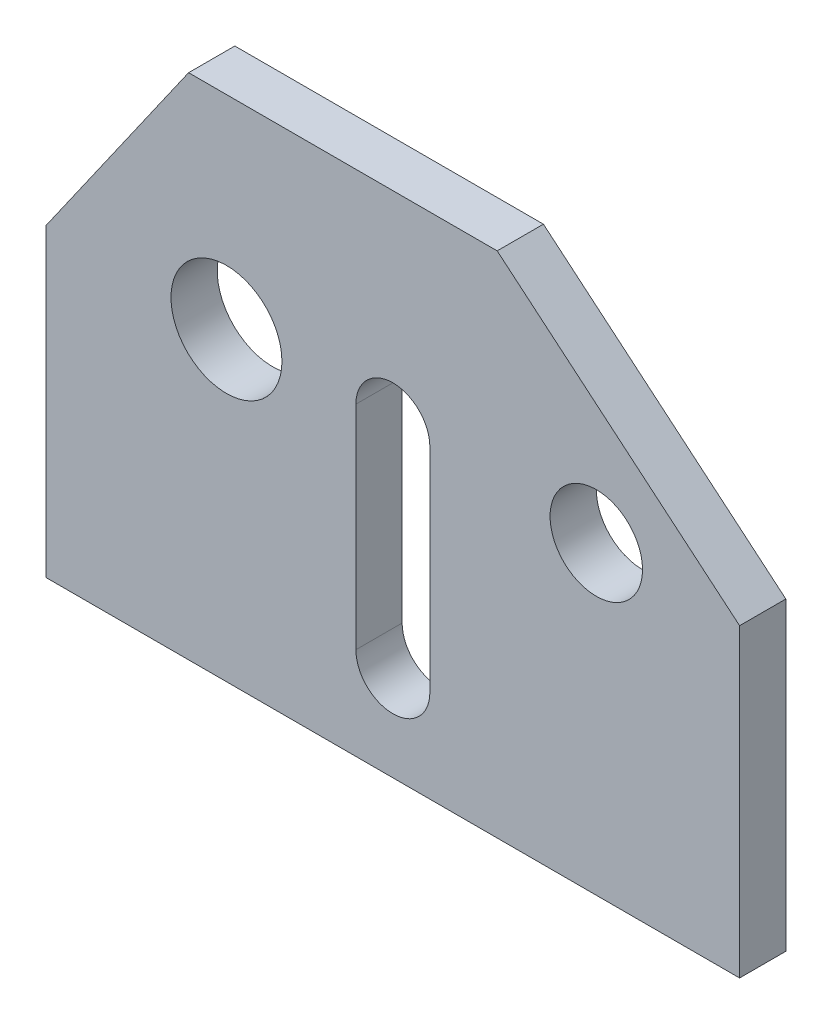
ISO-10303-21;
HEADER;
FILE_DESCRIPTION(('STEP AP214'),'2;1');
FILE_NAME('part.step','',(''),(''),'','','');
FILE_SCHEMA(('AUTOMOTIVE_DESIGN { 1 0 10303 214 1 1 1 1 }'));
ENDSEC;
DATA;
#1=APPLICATION_CONTEXT('core data for automotive mechanical design processes');
#2=APPLICATION_PROTOCOL_DEFINITION('international standard','automotive_design',2000,#1);
#3=PRODUCT_CONTEXT('',#1,'mechanical');
#4=PRODUCT('Part','Part','',(#3));
#5=PRODUCT_RELATED_PRODUCT_CATEGORY('part','',(#4));
#6=PRODUCT_DEFINITION_FORMATION('','',#4);
#7=PRODUCT_DEFINITION_CONTEXT('part definition',#1,'design');
#8=PRODUCT_DEFINITION('design','',#6,#7);
#9=PRODUCT_DEFINITION_SHAPE('','',#8);
#10=(LENGTH_UNIT() NAMED_UNIT(*) SI_UNIT(.MILLI.,.METRE.));
#11=(NAMED_UNIT(*) PLANE_ANGLE_UNIT() SI_UNIT($,.RADIAN.));
#12=(NAMED_UNIT(*) SI_UNIT($,.STERADIAN.) SOLID_ANGLE_UNIT());
#13=UNCERTAINTY_MEASURE_WITH_UNIT(LENGTH_MEASURE(1.E-05),#10,'distance_accuracy_value','');
#14=(GEOMETRIC_REPRESENTATION_CONTEXT(3) GLOBAL_UNCERTAINTY_ASSIGNED_CONTEXT((#13)) GLOBAL_UNIT_ASSIGNED_CONTEXT((#10,
#11,#12)) REPRESENTATION_CONTEXT('',''));
#15=CARTESIAN_POINT('',(0.,0.,0.));
#16=DIRECTION('',(0.,0.,1.));
#17=DIRECTION('',(1.,0.,0.));
#18=AXIS2_PLACEMENT_3D('',#15,#16,#17);
#19=CARTESIAN_POINT('',(0.,0.,5.));
#20=DIRECTION('',(0.,0.,1.));
#21=DIRECTION('',(1.,0.,0.));
#22=AXIS2_PLACEMENT_3D('',#19,#20,#21);
#23=PLANE('',#22);
#24=CARTESIAN_POINT('',(19.5,33.,5.));
#25=DIRECTION('',(0.,0.,1.));
#26=DIRECTION('',(1.,0.,0.));
#27=AXIS2_PLACEMENT_3D('',#24,#25,#26);
#28=CIRCLE('',#27,6.);
#29=CARTESIAN_POINT('',(25.5,33.,5.));
#30=VERTEX_POINT('',#29);
#31=EDGE_CURVE('E156',#30,#30,#28,.T.);
#32=ORIENTED_EDGE('',*,*,#31,.F.);
#33=EDGE_LOOP('',(#32));
#34=FACE_BOUND('',#33,.T.);
#35=DIRECTION('',(0.,-1.,0.));
#36=VECTOR('',#35,1.);
#37=CARTESIAN_POINT('',(0.,33.,5.));
#38=LINE('',#37,#36);
#39=CARTESIAN_POINT('',(0.,33.,5.));
#40=VERTEX_POINT('',#39);
#41=CARTESIAN_POINT('',(0.,0.,5.));
#42=VERTEX_POINT('',#41);
#43=EDGE_CURVE('E163',#40,#42,#38,.T.);
#44=ORIENTED_EDGE('',*,*,#43,.T.);
#45=DIRECTION('',(1.,0.,0.));
#46=VECTOR('',#45,1.);
#47=CARTESIAN_POINT('',(0.,0.,5.));
#48=LINE('',#47,#46);
#49=CARTESIAN_POINT('',(75.,0.,5.));
#50=VERTEX_POINT('',#49);
#51=EDGE_CURVE('E167',#42,#50,#48,.T.);
#52=ORIENTED_EDGE('',*,*,#51,.T.);
#53=DIRECTION('',(0.,1.,0.));
#54=VECTOR('',#53,1.);
#55=CARTESIAN_POINT('',(75.,0.,5.));
#56=LINE('',#55,#54);
#57=CARTESIAN_POINT('',(75.,33.,5.));
#58=VERTEX_POINT('',#57);
#59=EDGE_CURVE('E169',#50,#58,#56,.T.);
#60=ORIENTED_EDGE('',*,*,#59,.T.);
#61=DIRECTION('',(-0.766044443118979,0.642787609686538,0.));
#62=VECTOR('',#61,1.);
#63=CARTESIAN_POINT('',(75.,33.,5.));
#64=LINE('',#63,#62);
#65=CARTESIAN_POINT('',(48.7814209629273,55.,5.));
#66=VERTEX_POINT('',#65);
#67=EDGE_CURVE('E175',#58,#66,#64,.T.);
#68=ORIENTED_EDGE('',*,*,#67,.T.);
#69=DIRECTION('',(-1.,0.,0.));
#70=VECTOR('',#69,1.);
#71=CARTESIAN_POINT('',(48.7814209629273,55.,5.));
#72=LINE('',#71,#70);
#73=CARTESIAN_POINT('',(15.4045658406137,55.,5.));
#74=VERTEX_POINT('',#73);
#75=EDGE_CURVE('E174',#66,#74,#72,.T.);
#76=ORIENTED_EDGE('',*,*,#75,.T.);
#77=DIRECTION('',(-0.573576436351047,-0.819152044288991,0.));
#78=VECTOR('',#77,1.);
#79=CARTESIAN_POINT('',(15.4045658406137,55.,5.));
#80=LINE('',#79,#78);
#81=EDGE_CURVE('E176',#74,#40,#80,.T.);
#82=ORIENTED_EDGE('',*,*,#81,.T.);
#83=EDGE_LOOP('',(#44,#52,#60,#68,#76,#82));
#84=FACE_BOUND('',#83,.T.);
#85=CARTESIAN_POINT('',(59.5,33.,5.));
#86=DIRECTION('',(0.,0.,1.));
#87=DIRECTION('',(1.,0.,0.));
#88=AXIS2_PLACEMENT_3D('',#85,#86,#87);
#89=CIRCLE('',#88,5.00000000000001);
#90=CARTESIAN_POINT('',(64.5,33.,5.));
#91=VERTEX_POINT('',#90);
#92=EDGE_CURVE('E152',#91,#91,#89,.T.);
#93=ORIENTED_EDGE('',*,*,#92,.F.);
#94=EDGE_LOOP('',(#93));
#95=FACE_BOUND('',#94,.T.);
#96=DIRECTION('',(0.,-1.,0.));
#97=VECTOR('',#96,1.);
#98=CARTESIAN_POINT('',(33.5,33.,5.));
#99=LINE('',#98,#97);
#100=CARTESIAN_POINT('',(33.5,33.,5.));
#101=VERTEX_POINT('',#100);
#102=CARTESIAN_POINT('',(33.5,10.,5.));
#103=VERTEX_POINT('',#102);
#104=EDGE_CURVE('E125',#101,#103,#99,.T.);
#105=ORIENTED_EDGE('',*,*,#104,.F.);
#106=CARTESIAN_POINT('',(37.5,33.,5.));
#107=DIRECTION('',(0.,0.,1.));
#108=DIRECTION('',(1.,0.,0.));
#109=AXIS2_PLACEMENT_3D('',#106,#107,#108);
#110=CIRCLE('',#109,4.);
#111=CARTESIAN_POINT('',(41.5,33.,5.));
#112=VERTEX_POINT('',#111);
#113=EDGE_CURVE('E116',#112,#101,#110,.T.);
#114=ORIENTED_EDGE('',*,*,#113,.F.);
#115=DIRECTION('',(0.,1.,0.));
#116=VECTOR('',#115,1.);
#117=CARTESIAN_POINT('',(41.5,33.,5.));
#118=LINE('',#117,#116);
#119=CARTESIAN_POINT('',(41.5,10.,5.));
#120=VERTEX_POINT('',#119);
#121=EDGE_CURVE('E138',#120,#112,#118,.T.);
#122=ORIENTED_EDGE('',*,*,#121,.F.);
#123=CARTESIAN_POINT('',(37.5,10.,5.));
#124=DIRECTION('',(0.,0.,1.));
#125=DIRECTION('',(1.,0.,0.));
#126=AXIS2_PLACEMENT_3D('',#123,#124,#125);
#127=CIRCLE('',#126,3.99999999999999);
#128=EDGE_CURVE('E136',#103,#120,#127,.T.);
#129=ORIENTED_EDGE('',*,*,#128,.F.);
#130=EDGE_LOOP('',(#105,#114,#122,#129));
#131=FACE_BOUND('',#130,.T.);
#132=ADVANCED_FACE('F39',(#34,#84,#95,#131),#23,.T.);
#133=CARTESIAN_POINT('',(0.,0.,0.));
#134=DIRECTION('',(0.,0.,1.));
#135=DIRECTION('',(1.,0.,0.));
#136=AXIS2_PLACEMENT_3D('',#133,#134,#135);
#137=PLANE('',#136);
#138=CARTESIAN_POINT('',(59.5,33.,0.));
#139=DIRECTION('',(0.,0.,1.));
#140=DIRECTION('',(1.,0.,0.));
#141=AXIS2_PLACEMENT_3D('',#138,#139,#140);
#142=CIRCLE('',#141,5.00000000000001);
#143=CARTESIAN_POINT('',(64.5,33.,0.));
#144=VERTEX_POINT('',#143);
#145=EDGE_CURVE('E135',#144,#144,#142,.T.);
#146=ORIENTED_EDGE('',*,*,#145,.T.);
#147=EDGE_LOOP('',(#146));
#148=FACE_BOUND('',#147,.T.);
#149=CARTESIAN_POINT('',(19.5,33.,0.));
#150=DIRECTION('',(0.,0.,1.));
#151=DIRECTION('',(1.,0.,0.));
#152=AXIS2_PLACEMENT_3D('',#149,#150,#151);
#153=CIRCLE('',#152,6.);
#154=CARTESIAN_POINT('',(25.5,33.,0.));
#155=VERTEX_POINT('',#154);
#156=EDGE_CURVE('E155',#155,#155,#153,.T.);
#157=ORIENTED_EDGE('',*,*,#156,.T.);
#158=EDGE_LOOP('',(#157));
#159=FACE_BOUND('',#158,.T.);
#160=DIRECTION('',(0.,-1.,0.));
#161=VECTOR('',#160,1.);
#162=CARTESIAN_POINT('',(0.,33.,0.));
#163=LINE('',#162,#161);
#164=CARTESIAN_POINT('',(0.,33.,0.));
#165=VERTEX_POINT('',#164);
#166=CARTESIAN_POINT('',(0.,0.,0.));
#167=VERTEX_POINT('',#166);
#168=EDGE_CURVE('E161',#165,#167,#163,.T.);
#169=ORIENTED_EDGE('',*,*,#168,.F.);
#170=DIRECTION('',(-0.573576436351047,-0.819152044288991,0.));
#171=VECTOR('',#170,1.);
#172=CARTESIAN_POINT('',(15.4045658406137,55.,0.));
#173=LINE('',#172,#171);
#174=CARTESIAN_POINT('',(15.4045658406137,55.,0.));
#175=VERTEX_POINT('',#174);
#176=EDGE_CURVE('E166',#175,#165,#173,.T.);
#177=ORIENTED_EDGE('',*,*,#176,.F.);
#178=DIRECTION('',(-1.,0.,0.));
#179=VECTOR('',#178,1.);
#180=CARTESIAN_POINT('',(48.7814209629273,55.,0.));
#181=LINE('',#180,#179);
#182=CARTESIAN_POINT('',(48.7814209629273,55.,0.));
#183=VERTEX_POINT('',#182);
#184=EDGE_CURVE('E190',#183,#175,#181,.T.);
#185=ORIENTED_EDGE('',*,*,#184,.F.);
#186=DIRECTION('',(-0.766044443118979,0.642787609686538,0.));
#187=VECTOR('',#186,1.);
#188=CARTESIAN_POINT('',(75.,33.,0.));
#189=LINE('',#188,#187);
#190=CARTESIAN_POINT('',(75.,33.,0.));
#191=VERTEX_POINT('',#190);
#192=EDGE_CURVE('E184',#191,#183,#189,.T.);
#193=ORIENTED_EDGE('',*,*,#192,.F.);
#194=DIRECTION('',(0.,1.,0.));
#195=VECTOR('',#194,1.);
#196=CARTESIAN_POINT('',(75.,0.,0.));
#197=LINE('',#196,#195);
#198=CARTESIAN_POINT('',(75.,0.,0.));
#199=VERTEX_POINT('',#198);
#200=EDGE_CURVE('E183',#199,#191,#197,.T.);
#201=ORIENTED_EDGE('',*,*,#200,.F.);
#202=DIRECTION('',(1.,0.,0.));
#203=VECTOR('',#202,1.);
#204=CARTESIAN_POINT('',(0.,0.,0.));
#205=LINE('',#204,#203);
#206=EDGE_CURVE('E181',#167,#199,#205,.T.);
#207=ORIENTED_EDGE('',*,*,#206,.F.);
#208=EDGE_LOOP('',(#169,#177,#185,#193,#201,#207));
#209=FACE_BOUND('',#208,.T.);
#210=CARTESIAN_POINT('',(37.5,33.,0.));
#211=DIRECTION('',(0.,0.,1.));
#212=DIRECTION('',(1.,0.,0.));
#213=AXIS2_PLACEMENT_3D('',#210,#211,#212);
#214=CIRCLE('',#213,4.);
#215=CARTESIAN_POINT('',(41.5,33.,0.));
#216=VERTEX_POINT('',#215);
#217=CARTESIAN_POINT('',(33.5,33.,0.));
#218=VERTEX_POINT('',#217);
#219=EDGE_CURVE('E62',#216,#218,#214,.T.);
#220=ORIENTED_EDGE('',*,*,#219,.T.);
#221=DIRECTION('',(0.,-1.,0.));
#222=VECTOR('',#221,1.);
#223=CARTESIAN_POINT('',(33.5,33.,0.));
#224=LINE('',#223,#222);
#225=CARTESIAN_POINT('',(33.5,10.,0.));
#226=VERTEX_POINT('',#225);
#227=EDGE_CURVE('E131',#218,#226,#224,.T.);
#228=ORIENTED_EDGE('',*,*,#227,.T.);
#229=CARTESIAN_POINT('',(37.5,10.,0.));
#230=DIRECTION('',(0.,0.,1.));
#231=DIRECTION('',(1.,0.,0.));
#232=AXIS2_PLACEMENT_3D('',#229,#230,#231);
#233=CIRCLE('',#232,3.99999999999999);
#234=CARTESIAN_POINT('',(41.5,10.,0.));
#235=VERTEX_POINT('',#234);
#236=EDGE_CURVE('E143',#226,#235,#233,.T.);
#237=ORIENTED_EDGE('',*,*,#236,.T.);
#238=DIRECTION('',(0.,1.,0.));
#239=VECTOR('',#238,1.);
#240=CARTESIAN_POINT('',(41.5,33.,0.));
#241=LINE('',#240,#239);
#242=EDGE_CURVE('E124',#235,#216,#241,.T.);
#243=ORIENTED_EDGE('',*,*,#242,.T.);
#244=EDGE_LOOP('',(#220,#228,#237,#243));
#245=FACE_BOUND('',#244,.T.);
#246=ADVANCED_FACE('F213',(#148,#159,#209,#245),#137,.F.);
#247=CARTESIAN_POINT('',(0.,33.,5.));
#248=DIRECTION('',(1.,0.,0.));
#249=DIRECTION('',(0.,1.,0.));
#250=AXIS2_PLACEMENT_3D('',#247,#248,#249);
#251=PLANE('',#250);
#252=ORIENTED_EDGE('',*,*,#168,.T.);
#253=DIRECTION('',(0.,0.,-1.));
#254=VECTOR('',#253,1.);
#255=CARTESIAN_POINT('',(0.,0.,5.));
#256=LINE('',#255,#254);
#257=EDGE_CURVE('E11',#42,#167,#256,.T.);
#258=ORIENTED_EDGE('',*,*,#257,.F.);
#259=ORIENTED_EDGE('',*,*,#43,.F.);
#260=DIRECTION('',(0.,0.,-1.));
#261=VECTOR('',#260,1.);
#262=CARTESIAN_POINT('',(0.,33.,5.));
#263=LINE('',#262,#261);
#264=EDGE_CURVE('E178',#40,#165,#263,.T.);
#265=ORIENTED_EDGE('',*,*,#264,.T.);
#266=EDGE_LOOP('',(#252,#258,#259,#265));
#267=FACE_BOUND('',#266,.T.);
#268=ADVANCED_FACE('F41',(#267),#251,.F.);
#269=CARTESIAN_POINT('',(0.,0.,5.));
#270=DIRECTION('',(0.,1.,0.));
#271=DIRECTION('',(0.,0.,1.));
#272=AXIS2_PLACEMENT_3D('',#269,#270,#271);
#273=PLANE('',#272);
#274=ORIENTED_EDGE('',*,*,#206,.T.);
#275=DIRECTION('',(0.,0.,-1.));
#276=VECTOR('',#275,1.);
#277=CARTESIAN_POINT('',(75.,0.,5.));
#278=LINE('',#277,#276);
#279=EDGE_CURVE('E50',#50,#199,#278,.T.);
#280=ORIENTED_EDGE('',*,*,#279,.F.);
#281=ORIENTED_EDGE('',*,*,#51,.F.);
#282=ORIENTED_EDGE('',*,*,#257,.T.);
#283=EDGE_LOOP('',(#274,#280,#281,#282));
#284=FACE_BOUND('',#283,.T.);
#285=ADVANCED_FACE('F227',(#284),#273,.F.);
#286=CARTESIAN_POINT('',(75.,0.,5.));
#287=DIRECTION('',(-1.,0.,0.));
#288=DIRECTION('',(0.,0.,1.));
#289=AXIS2_PLACEMENT_3D('',#286,#287,#288);
#290=PLANE('',#289);
#291=ORIENTED_EDGE('',*,*,#200,.T.);
#292=DIRECTION('',(0.,0.,-1.));
#293=VECTOR('',#292,1.);
#294=CARTESIAN_POINT('',(75.,33.,5.));
#295=LINE('',#294,#293);
#296=EDGE_CURVE('E199',#58,#191,#295,.T.);
#297=ORIENTED_EDGE('',*,*,#296,.F.);
#298=ORIENTED_EDGE('',*,*,#59,.F.);
#299=ORIENTED_EDGE('',*,*,#279,.T.);
#300=EDGE_LOOP('',(#291,#297,#298,#299));
#301=FACE_BOUND('',#300,.T.);
#302=ADVANCED_FACE('F203',(#301),#290,.F.);
#303=CARTESIAN_POINT('',(75.,33.,5.));
#304=DIRECTION('',(-0.642787609686538,-0.766044443118979,0.));
#305=DIRECTION('',(0.766044443118979,-0.642787609686538,0.));
#306=AXIS2_PLACEMENT_3D('',#303,#304,#305);
#307=PLANE('',#306);
#308=ORIENTED_EDGE('',*,*,#192,.T.);
#309=DIRECTION('',(0.,0.,-1.));
#310=VECTOR('',#309,1.);
#311=CARTESIAN_POINT('',(48.7814209629273,55.,5.));
#312=LINE('',#311,#310);
#313=EDGE_CURVE('E193',#66,#183,#312,.T.);
#314=ORIENTED_EDGE('',*,*,#313,.F.);
#315=ORIENTED_EDGE('',*,*,#67,.F.);
#316=ORIENTED_EDGE('',*,*,#296,.T.);
#317=EDGE_LOOP('',(#308,#314,#315,#316));
#318=FACE_BOUND('',#317,.T.);
#319=ADVANCED_FACE('F220',(#318),#307,.F.);
#320=CARTESIAN_POINT('',(48.7814209629273,55.,5.));
#321=DIRECTION('',(0.,-1.,0.));
#322=DIRECTION('',(1.,0.,0.));
#323=AXIS2_PLACEMENT_3D('',#320,#321,#322);
#324=PLANE('',#323);
#325=ORIENTED_EDGE('',*,*,#184,.T.);
#326=DIRECTION('',(0.,0.,-1.));
#327=VECTOR('',#326,1.);
#328=CARTESIAN_POINT('',(15.4045658406137,55.,5.));
#329=LINE('',#328,#327);
#330=EDGE_CURVE('E195',#74,#175,#329,.T.);
#331=ORIENTED_EDGE('',*,*,#330,.F.);
#332=ORIENTED_EDGE('',*,*,#75,.F.);
#333=ORIENTED_EDGE('',*,*,#313,.T.);
#334=EDGE_LOOP('',(#325,#331,#332,#333));
#335=FACE_BOUND('',#334,.T.);
#336=ADVANCED_FACE('F221',(#335),#324,.F.);
#337=CARTESIAN_POINT('',(15.4045658406137,55.,5.));
#338=DIRECTION('',(0.819152044288991,-0.573576436351047,0.));
#339=DIRECTION('',(0.573576436351047,0.819152044288991,0.));
#340=AXIS2_PLACEMENT_3D('',#337,#338,#339);
#341=PLANE('',#340);
#342=ORIENTED_EDGE('',*,*,#176,.T.);
#343=ORIENTED_EDGE('',*,*,#264,.F.);
#344=ORIENTED_EDGE('',*,*,#81,.F.);
#345=ORIENTED_EDGE('',*,*,#330,.T.);
#346=EDGE_LOOP('',(#342,#343,#344,#345));
#347=FACE_BOUND('',#346,.T.);
#348=ADVANCED_FACE('F235',(#347),#341,.F.);
#349=CARTESIAN_POINT('',(19.5,33.,5.));
#350=DIRECTION('',(0.,0.,-1.));
#351=DIRECTION('',(-1.,0.,0.));
#352=AXIS2_PLACEMENT_3D('',#349,#350,#351);
#353=CYLINDRICAL_SURFACE('',#352,6.);
#354=ORIENTED_EDGE('',*,*,#31,.T.);
#355=EDGE_LOOP('',(#354));
#356=FACE_BOUND('',#355,.T.);
#357=ORIENTED_EDGE('',*,*,#156,.F.);
#358=EDGE_LOOP('',(#357));
#359=FACE_BOUND('',#358,.T.);
#360=ADVANCED_FACE('F233',(#356,#359),#353,.F.);
#361=CARTESIAN_POINT('',(59.5,33.,5.));
#362=DIRECTION('',(0.,0.,-1.));
#363=DIRECTION('',(-1.,0.,0.));
#364=AXIS2_PLACEMENT_3D('',#361,#362,#363);
#365=CYLINDRICAL_SURFACE('',#364,5.00000000000001);
#366=ORIENTED_EDGE('',*,*,#92,.T.);
#367=EDGE_LOOP('',(#366));
#368=FACE_BOUND('',#367,.T.);
#369=ORIENTED_EDGE('',*,*,#145,.F.);
#370=EDGE_LOOP('',(#369));
#371=FACE_BOUND('',#370,.T.);
#372=ADVANCED_FACE('F238',(#368,#371),#365,.F.);
#373=CARTESIAN_POINT('',(37.5,33.,5.));
#374=DIRECTION('',(0.,0.,-1.));
#375=DIRECTION('',(-1.,0.,0.));
#376=AXIS2_PLACEMENT_3D('',#373,#374,#375);
#377=CYLINDRICAL_SURFACE('',#376,4.);
#378=ORIENTED_EDGE('',*,*,#219,.F.);
#379=DIRECTION('',(0.,0.,-1.));
#380=VECTOR('',#379,1.);
#381=CARTESIAN_POINT('',(41.5,33.,5.));
#382=LINE('',#381,#380);
#383=EDGE_CURVE('E120',#112,#216,#382,.T.);
#384=ORIENTED_EDGE('',*,*,#383,.F.);
#385=ORIENTED_EDGE('',*,*,#113,.T.);
#386=DIRECTION('',(0.,0.,-1.));
#387=VECTOR('',#386,1.);
#388=CARTESIAN_POINT('',(33.5,33.,5.));
#389=LINE('',#388,#387);
#390=EDGE_CURVE('E118',#101,#218,#389,.T.);
#391=ORIENTED_EDGE('',*,*,#390,.T.);
#392=EDGE_LOOP('',(#378,#384,#385,#391));
#393=FACE_BOUND('',#392,.T.);
#394=ADVANCED_FACE('F119',(#393),#377,.F.);
#395=CARTESIAN_POINT('',(33.5,33.,5.));
#396=DIRECTION('',(1.,0.,0.));
#397=DIRECTION('',(0.,1.,0.));
#398=AXIS2_PLACEMENT_3D('',#395,#396,#397);
#399=PLANE('',#398);
#400=ORIENTED_EDGE('',*,*,#227,.F.);
#401=ORIENTED_EDGE('',*,*,#390,.F.);
#402=ORIENTED_EDGE('',*,*,#104,.T.);
#403=DIRECTION('',(0.,0.,-1.));
#404=VECTOR('',#403,1.);
#405=CARTESIAN_POINT('',(33.5,10.,5.));
#406=LINE('',#405,#404);
#407=EDGE_CURVE('E133',#103,#226,#406,.T.);
#408=ORIENTED_EDGE('',*,*,#407,.T.);
#409=EDGE_LOOP('',(#400,#401,#402,#408));
#410=FACE_BOUND('',#409,.T.);
#411=ADVANCED_FACE('F126',(#410),#399,.T.);
#412=CARTESIAN_POINT('',(37.5,10.,5.));
#413=DIRECTION('',(0.,0.,-1.));
#414=DIRECTION('',(-1.,0.,0.));
#415=AXIS2_PLACEMENT_3D('',#412,#413,#414);
#416=CYLINDRICAL_SURFACE('',#415,3.99999999999999);
#417=ORIENTED_EDGE('',*,*,#236,.F.);
#418=ORIENTED_EDGE('',*,*,#407,.F.);
#419=ORIENTED_EDGE('',*,*,#128,.T.);
#420=DIRECTION('',(0.,0.,-1.));
#421=VECTOR('',#420,1.);
#422=CARTESIAN_POINT('',(41.5,10.,5.));
#423=LINE('',#422,#421);
#424=EDGE_CURVE('E53',#120,#235,#423,.T.);
#425=ORIENTED_EDGE('',*,*,#424,.T.);
#426=EDGE_LOOP('',(#417,#418,#419,#425));
#427=FACE_BOUND('',#426,.T.);
#428=ADVANCED_FACE('F263',(#427),#416,.F.);
#429=CARTESIAN_POINT('',(41.5,33.,5.));
#430=DIRECTION('',(-1.,0.,0.));
#431=DIRECTION('',(0.,0.,1.));
#432=AXIS2_PLACEMENT_3D('',#429,#430,#431);
#433=PLANE('',#432);
#434=ORIENTED_EDGE('',*,*,#242,.F.);
#435=ORIENTED_EDGE('',*,*,#424,.F.);
#436=ORIENTED_EDGE('',*,*,#121,.T.);
#437=ORIENTED_EDGE('',*,*,#383,.T.);
#438=EDGE_LOOP('',(#434,#435,#436,#437));
#439=FACE_BOUND('',#438,.T.);
#440=ADVANCED_FACE('F264',(#439),#433,.T.);
#441=CLOSED_SHELL('',(#132,#246,#268,#285,#302,#319,#336,#348,#360,#372,#394,#411,#428,#440));
#442=MANIFOLD_SOLID_BREP('B2',#441);
#443=ADVANCED_BREP_SHAPE_REPRESENTATION('',(#18,#442),#14);
#444=SHAPE_DEFINITION_REPRESENTATION(#9,#443);
ENDSEC;
END-ISO-10303-21;
